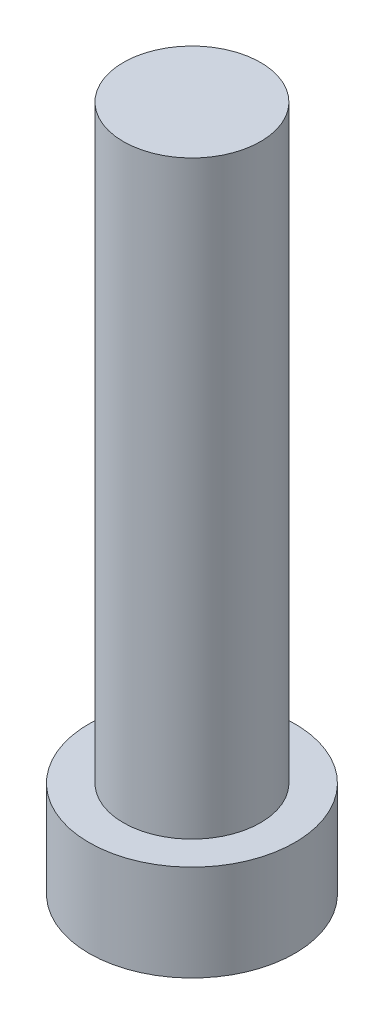
ISO-10303-21;
HEADER;
FILE_DESCRIPTION(('STEP AP214'),'2;1');
FILE_NAME('part.step','',(''),(''),'','','');
FILE_SCHEMA(('AUTOMOTIVE_DESIGN { 1 0 10303 214 1 1 1 1 }'));
ENDSEC;
DATA;
#1=APPLICATION_CONTEXT('core data for automotive mechanical design processes');
#2=APPLICATION_PROTOCOL_DEFINITION('international standard','automotive_design',2000,#1);
#3=PRODUCT_CONTEXT('',#1,'mechanical');
#4=PRODUCT('Part','Part','',(#3));
#5=PRODUCT_RELATED_PRODUCT_CATEGORY('part','',(#4));
#6=PRODUCT_DEFINITION_FORMATION('','',#4);
#7=PRODUCT_DEFINITION_CONTEXT('part definition',#1,'design');
#8=PRODUCT_DEFINITION('design','',#6,#7);
#9=PRODUCT_DEFINITION_SHAPE('','',#8);
#10=(LENGTH_UNIT() NAMED_UNIT(*) SI_UNIT(.MILLI.,.METRE.));
#11=(NAMED_UNIT(*) PLANE_ANGLE_UNIT() SI_UNIT($,.RADIAN.));
#12=(NAMED_UNIT(*) SI_UNIT($,.STERADIAN.) SOLID_ANGLE_UNIT());
#13=UNCERTAINTY_MEASURE_WITH_UNIT(LENGTH_MEASURE(1.E-05),#10,'distance_accuracy_value','');
#14=(GEOMETRIC_REPRESENTATION_CONTEXT(3) GLOBAL_UNCERTAINTY_ASSIGNED_CONTEXT((#13)) GLOBAL_UNIT_ASSIGNED_CONTEXT((#10,
#11,#12)) REPRESENTATION_CONTEXT('',''));
#15=CARTESIAN_POINT('',(0.,0.,0.));
#16=DIRECTION('',(0.,0.,1.));
#17=DIRECTION('',(1.,0.,0.));
#18=AXIS2_PLACEMENT_3D('',#15,#16,#17);
#19=CARTESIAN_POINT('',(0.,7.,0.));
#20=DIRECTION('',(0.,-1.,0.));
#21=DIRECTION('',(0.,0.,-1.));
#22=AXIS2_PLACEMENT_3D('',#19,#20,#21);
#23=CYLINDRICAL_SURFACE('',#22,7.5);
#24=CARTESIAN_POINT('',(0.,7.,0.));
#25=DIRECTION('',(0.,1.,0.));
#26=DIRECTION('',(0.,0.,1.));
#27=AXIS2_PLACEMENT_3D('',#24,#25,#26);
#28=CIRCLE('',#27,7.5);
#29=CARTESIAN_POINT('',(0.,7.,7.5));
#30=VERTEX_POINT('',#29);
#31=EDGE_CURVE('E42',#30,#30,#28,.T.);
#32=ORIENTED_EDGE('',*,*,#31,.F.);
#33=EDGE_LOOP('',(#32));
#34=FACE_BOUND('',#33,.T.);
#35=CARTESIAN_POINT('',(0.,0.,0.));
#36=DIRECTION('',(0.,1.,0.));
#37=DIRECTION('',(0.,0.,1.));
#38=AXIS2_PLACEMENT_3D('',#35,#36,#37);
#39=CIRCLE('',#38,7.5);
#40=CARTESIAN_POINT('',(0.,0.,7.5));
#41=VERTEX_POINT('',#40);
#42=EDGE_CURVE('E38',#41,#41,#39,.T.);
#43=ORIENTED_EDGE('',*,*,#42,.T.);
#44=EDGE_LOOP('',(#43));
#45=FACE_BOUND('',#44,.T.);
#46=ADVANCED_FACE('F35',(#34,#45),#23,.T.);
#47=CARTESIAN_POINT('',(0.,7.,0.));
#48=DIRECTION('',(0.,1.,0.));
#49=DIRECTION('',(0.,0.,1.));
#50=AXIS2_PLACEMENT_3D('',#47,#48,#49);
#51=PLANE('',#50);
#52=CARTESIAN_POINT('',(0.,7.,0.));
#53=DIRECTION('',(0.,1.,0.));
#54=DIRECTION('',(0.,0.,1.));
#55=AXIS2_PLACEMENT_3D('',#52,#53,#54);
#56=CIRCLE('',#55,5.);
#57=CARTESIAN_POINT('',(0.,7.,5.));
#58=VERTEX_POINT('',#57);
#59=EDGE_CURVE('E10',#58,#58,#56,.T.);
#60=ORIENTED_EDGE('',*,*,#59,.F.);
#61=EDGE_LOOP('',(#60));
#62=FACE_BOUND('',#61,.T.);
#63=ORIENTED_EDGE('',*,*,#31,.T.);
#64=EDGE_LOOP('',(#63));
#65=FACE_BOUND('',#64,.T.);
#66=ADVANCED_FACE('F59',(#62,#65),#51,.T.);
#67=CARTESIAN_POINT('',(0.,0.,0.));
#68=DIRECTION('',(0.,1.,0.));
#69=DIRECTION('',(0.,0.,1.));
#70=AXIS2_PLACEMENT_3D('',#67,#68,#69);
#71=PLANE('',#70);
#72=ORIENTED_EDGE('',*,*,#42,.F.);
#73=EDGE_LOOP('',(#72));
#74=FACE_BOUND('',#73,.T.);
#75=ADVANCED_FACE('F56',(#74),#71,.F.);
#76=CARTESIAN_POINT('',(0.,50.,0.));
#77=DIRECTION('',(0.,-1.,0.));
#78=DIRECTION('',(0.,0.,-1.));
#79=AXIS2_PLACEMENT_3D('',#76,#77,#78);
#80=CYLINDRICAL_SURFACE('',#79,5.);
#81=CARTESIAN_POINT('',(0.,50.,0.));
#82=DIRECTION('',(0.,1.,0.));
#83=DIRECTION('',(0.,0.,1.));
#84=AXIS2_PLACEMENT_3D('',#81,#82,#83);
#85=CIRCLE('',#84,5.);
#86=CARTESIAN_POINT('',(0.,50.,5.));
#87=VERTEX_POINT('',#86);
#88=EDGE_CURVE('E48',#87,#87,#85,.T.);
#89=ORIENTED_EDGE('',*,*,#88,.F.);
#90=EDGE_LOOP('',(#89));
#91=FACE_BOUND('',#90,.T.);
#92=ORIENTED_EDGE('',*,*,#59,.T.);
#93=EDGE_LOOP('',(#92));
#94=FACE_BOUND('',#93,.T.);
#95=ADVANCED_FACE('F58',(#91,#94),#80,.T.);
#96=CARTESIAN_POINT('',(0.,50.,0.));
#97=DIRECTION('',(0.,1.,0.));
#98=DIRECTION('',(0.,0.,1.));
#99=AXIS2_PLACEMENT_3D('',#96,#97,#98);
#100=PLANE('',#99);
#101=ORIENTED_EDGE('',*,*,#88,.T.);
#102=EDGE_LOOP('',(#101));
#103=FACE_BOUND('',#102,.T.);
#104=ADVANCED_FACE('F64',(#103),#100,.T.);
#105=CLOSED_SHELL('',(#46,#66,#75,#95,#104));
#106=MANIFOLD_SOLID_BREP('B2',#105);
#107=ADVANCED_BREP_SHAPE_REPRESENTATION('',(#18,#106),#14);
#108=SHAPE_DEFINITION_REPRESENTATION(#9,#107);
ENDSEC;
END-ISO-10303-21;
